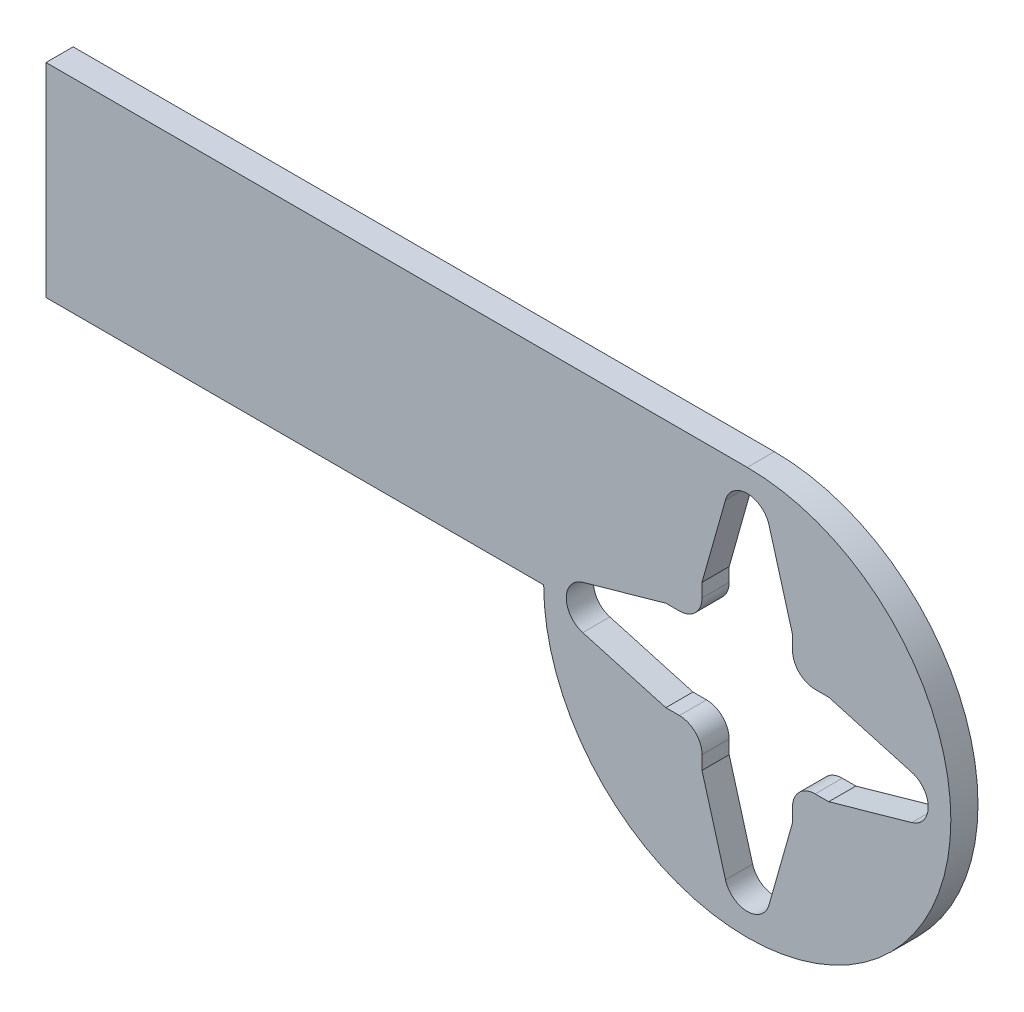
ISO-10303-21;
HEADER;
FILE_DESCRIPTION(('STEP AP214'),'2;1');
FILE_NAME('part.step','',(''),(''),'','','');
FILE_SCHEMA(('AUTOMOTIVE_DESIGN { 1 0 10303 214 1 1 1 1 }'));
ENDSEC;
DATA;
#1=APPLICATION_CONTEXT('core data for automotive mechanical design processes');
#2=APPLICATION_PROTOCOL_DEFINITION('international standard','automotive_design',2000,#1);
#3=PRODUCT_CONTEXT('',#1,'mechanical');
#4=PRODUCT('Part','Part','',(#3));
#5=PRODUCT_RELATED_PRODUCT_CATEGORY('part','',(#4));
#6=PRODUCT_DEFINITION_FORMATION('','',#4);
#7=PRODUCT_DEFINITION_CONTEXT('part definition',#1,'design');
#8=PRODUCT_DEFINITION('design','',#6,#7);
#9=PRODUCT_DEFINITION_SHAPE('','',#8);
#10=(LENGTH_UNIT() NAMED_UNIT(*) SI_UNIT(.MILLI.,.METRE.));
#11=(NAMED_UNIT(*) PLANE_ANGLE_UNIT() SI_UNIT($,.RADIAN.));
#12=(NAMED_UNIT(*) SI_UNIT($,.STERADIAN.) SOLID_ANGLE_UNIT());
#13=UNCERTAINTY_MEASURE_WITH_UNIT(LENGTH_MEASURE(1.E-05),#10,'distance_accuracy_value','');
#14=(GEOMETRIC_REPRESENTATION_CONTEXT(3) GLOBAL_UNCERTAINTY_ASSIGNED_CONTEXT((#13)) GLOBAL_UNIT_ASSIGNED_CONTEXT((#10,
#11,#12)) REPRESENTATION_CONTEXT('',''));
#15=CARTESIAN_POINT('',(0.,0.,0.));
#16=DIRECTION('',(0.,0.,1.));
#17=DIRECTION('',(1.,0.,0.));
#18=AXIS2_PLACEMENT_3D('',#15,#16,#17);
#19=CARTESIAN_POINT('',(0.,0.,3.));
#20=DIRECTION('',(0.,0.,-1.));
#21=DIRECTION('',(-1.,0.,0.));
#22=AXIS2_PLACEMENT_3D('',#19,#20,#21);
#23=CYLINDRICAL_SURFACE('',#22,22.5);
#24=CARTESIAN_POINT('',(0.,0.,0.));
#25=DIRECTION('',(0.,0.,1.));
#26=DIRECTION('',(1.,0.,0.));
#27=AXIS2_PLACEMENT_3D('',#24,#25,#26);
#28=CIRCLE('',#27,22.5);
#29=CARTESIAN_POINT('',(-22.5,0.,0.));
#30=VERTEX_POINT('',#29);
#31=CARTESIAN_POINT('',(0.,22.5,0.));
#32=VERTEX_POINT('',#31);
#33=EDGE_CURVE('E395',#30,#32,#28,.T.);
#34=ORIENTED_EDGE('',*,*,#33,.T.);
#35=DIRECTION('',(0.,0.,-1.));
#36=VECTOR('',#35,1.);
#37=CARTESIAN_POINT('',(0.,22.5,3.));
#38=LINE('',#37,#36);
#39=CARTESIAN_POINT('',(0.,22.5,3.));
#40=VERTEX_POINT('',#39);
#41=EDGE_CURVE('E142',#40,#32,#38,.T.);
#42=ORIENTED_EDGE('',*,*,#41,.F.);
#43=CARTESIAN_POINT('',(0.,0.,3.));
#44=DIRECTION('',(0.,0.,1.));
#45=DIRECTION('',(1.,0.,0.));
#46=AXIS2_PLACEMENT_3D('',#43,#44,#45);
#47=CIRCLE('',#46,22.5);
#48=CARTESIAN_POINT('',(-22.5,0.,3.));
#49=VERTEX_POINT('',#48);
#50=EDGE_CURVE('E391',#49,#40,#47,.T.);
#51=ORIENTED_EDGE('',*,*,#50,.F.);
#52=DIRECTION('',(0.,0.,-1.));
#53=VECTOR('',#52,1.);
#54=CARTESIAN_POINT('',(-22.5,0.,3.));
#55=LINE('',#54,#53);
#56=EDGE_CURVE('E12',#49,#30,#55,.T.);
#57=ORIENTED_EDGE('',*,*,#56,.T.);
#58=EDGE_LOOP('',(#34,#42,#51,#57));
#59=FACE_BOUND('',#58,.T.);
#60=ADVANCED_FACE('F131',(#59),#23,.T.);
#61=CARTESIAN_POINT('',(5.,0.,3.));
#62=DIRECTION('',(1.,0.,0.));
#63=DIRECTION('',(0.,0.,-1.));
#64=AXIS2_PLACEMENT_3D('',#61,#62,#63);
#65=PLANE('',#64);
#66=DIRECTION('',(0.,-1.,0.));
#67=VECTOR('',#66,1.);
#68=CARTESIAN_POINT('',(5.,0.,0.));
#69=LINE('',#68,#67);
#70=CARTESIAN_POINT('',(5.,-7.5,0.));
#71=VERTEX_POINT('',#70);
#72=CARTESIAN_POINT('',(5.,-9.,0.));
#73=VERTEX_POINT('',#72);
#74=EDGE_CURVE('E313',#71,#73,#69,.T.);
#75=ORIENTED_EDGE('',*,*,#74,.T.);
#76=DIRECTION('',(0.,0.,-1.));
#77=VECTOR('',#76,1.);
#78=CARTESIAN_POINT('',(5.,-9.,3.));
#79=LINE('',#78,#77);
#80=CARTESIAN_POINT('',(5.,-9.,3.));
#81=VERTEX_POINT('',#80);
#82=EDGE_CURVE('E317',#81,#73,#79,.T.);
#83=ORIENTED_EDGE('',*,*,#82,.F.);
#84=DIRECTION('',(0.,-1.,0.));
#85=VECTOR('',#84,1.);
#86=CARTESIAN_POINT('',(5.,0.,3.));
#87=LINE('',#86,#85);
#88=CARTESIAN_POINT('',(5.,-7.5,3.));
#89=VERTEX_POINT('',#88);
#90=EDGE_CURVE('E398',#89,#81,#87,.T.);
#91=ORIENTED_EDGE('',*,*,#90,.F.);
#92=DIRECTION('',(0.,0.,-1.));
#93=VECTOR('',#92,1.);
#94=CARTESIAN_POINT('',(5.,-7.5,3.));
#95=LINE('',#94,#93);
#96=EDGE_CURVE('E314',#89,#71,#95,.T.);
#97=ORIENTED_EDGE('',*,*,#96,.T.);
#98=EDGE_LOOP('',(#75,#83,#91,#97));
#99=FACE_BOUND('',#98,.T.);
#100=ADVANCED_FACE('F566',(#99),#65,.F.);
#101=CARTESIAN_POINT('',(6.98551163473582,-1.97409711694024,3.));
#102=DIRECTION('',(0.962311898410698,-0.271948175535705,0.));
#103=DIRECTION('',(0.271948175535705,0.962311898410698,0.));
#104=AXIS2_PLACEMENT_3D('',#101,#102,#103);
#105=PLANE('',#104);
#106=DIRECTION('',(-0.271948175535705,-0.962311898410698,0.));
#107=VECTOR('',#106,1.);
#108=CARTESIAN_POINT('',(6.98551163473582,-1.97409711694024,0.));
#109=LINE('',#108,#107);
#110=CARTESIAN_POINT('',(2.40577974602674,-18.1798704388393,0.));
#111=VERTEX_POINT('',#110);
#112=EDGE_CURVE('E467',#73,#111,#109,.T.);
#113=ORIENTED_EDGE('',*,*,#112,.T.);
#114=DIRECTION('',(0.,0.,-1.));
#115=VECTOR('',#114,1.);
#116=CARTESIAN_POINT('',(2.40577974602674,-18.1798704388393,3.));
#117=LINE('',#116,#115);
#118=CARTESIAN_POINT('',(2.40577974602674,-18.1798704388393,3.));
#119=VERTEX_POINT('',#118);
#120=EDGE_CURVE('E321',#119,#111,#117,.T.);
#121=ORIENTED_EDGE('',*,*,#120,.F.);
#122=DIRECTION('',(-0.271948175535705,-0.962311898410698,0.));
#123=VECTOR('',#122,1.);
#124=CARTESIAN_POINT('',(6.98551163473582,-1.97409711694024,3.));
#125=LINE('',#124,#123);
#126=EDGE_CURVE('E547',#81,#119,#125,.T.);
#127=ORIENTED_EDGE('',*,*,#126,.F.);
#128=ORIENTED_EDGE('',*,*,#82,.T.);
#129=EDGE_LOOP('',(#113,#121,#127,#128));
#130=FACE_BOUND('',#129,.T.);
#131=ADVANCED_FACE('F570',(#130),#105,.F.);
#132=CARTESIAN_POINT('',(0.,-17.5,3.));
#133=DIRECTION('',(0.,0.,-1.));
#134=DIRECTION('',(-1.,0.,0.));
#135=AXIS2_PLACEMENT_3D('',#132,#133,#134);
#136=CYLINDRICAL_SURFACE('',#135,2.5);
#137=CARTESIAN_POINT('',(0.,-17.5,0.));
#138=DIRECTION('',(0.,0.,1.));
#139=DIRECTION('',(1.,0.,0.));
#140=AXIS2_PLACEMENT_3D('',#137,#138,#139);
#141=CIRCLE('',#140,2.5);
#142=CARTESIAN_POINT('',(-2.40577974602674,-18.1798704388393,0.));
#143=VERTEX_POINT('',#142);
#144=EDGE_CURVE('E463',#111,#143,#141,.F.);
#145=ORIENTED_EDGE('',*,*,#144,.T.);
#146=DIRECTION('',(0.,0.,-1.));
#147=VECTOR('',#146,1.);
#148=CARTESIAN_POINT('',(-2.40577974602674,-18.1798704388393,3.));
#149=LINE('',#148,#147);
#150=CARTESIAN_POINT('',(-2.40577974602674,-18.1798704388393,3.));
#151=VERTEX_POINT('',#150);
#152=EDGE_CURVE('E325',#151,#143,#149,.T.);
#153=ORIENTED_EDGE('',*,*,#152,.F.);
#154=CARTESIAN_POINT('',(0.,-17.5,3.));
#155=DIRECTION('',(0.,0.,1.));
#156=DIRECTION('',(1.,0.,0.));
#157=AXIS2_PLACEMENT_3D('',#154,#155,#156);
#158=CIRCLE('',#157,2.5);
#159=EDGE_CURVE('E543',#119,#151,#158,.F.);
#160=ORIENTED_EDGE('',*,*,#159,.F.);
#161=ORIENTED_EDGE('',*,*,#120,.T.);
#162=EDGE_LOOP('',(#145,#153,#160,#161));
#163=FACE_BOUND('',#162,.T.);
#164=ADVANCED_FACE('F577',(#163),#136,.F.);
#165=CARTESIAN_POINT('',(-6.98551163473582,-1.97409711694024,3.));
#166=DIRECTION('',(0.962311898410698,0.271948175535705,0.));
#167=DIRECTION('',(-0.271948175535705,0.962311898410698,0.));
#168=AXIS2_PLACEMENT_3D('',#165,#166,#167);
#169=PLANE('',#168);
#170=DIRECTION('',(0.271948175535705,-0.962311898410698,0.));
#171=VECTOR('',#170,1.);
#172=CARTESIAN_POINT('',(-6.98551163473582,-1.97409711694024,0.));
#173=LINE('',#172,#171);
#174=CARTESIAN_POINT('',(-5.,-9.,0.));
#175=VERTEX_POINT('',#174);
#176=EDGE_CURVE('E459',#175,#143,#173,.T.);
#177=ORIENTED_EDGE('',*,*,#176,.F.);
#178=DIRECTION('',(0.,0.,-1.));
#179=VECTOR('',#178,1.);
#180=CARTESIAN_POINT('',(-5.,-9.,3.));
#181=LINE('',#180,#179);
#182=CARTESIAN_POINT('',(-5.,-9.,3.));
#183=VERTEX_POINT('',#182);
#184=EDGE_CURVE('E328',#183,#175,#181,.T.);
#185=ORIENTED_EDGE('',*,*,#184,.F.);
#186=DIRECTION('',(0.271948175535705,-0.962311898410698,0.));
#187=VECTOR('',#186,1.);
#188=CARTESIAN_POINT('',(-6.98551163473582,-1.97409711694024,3.));
#189=LINE('',#188,#187);
#190=EDGE_CURVE('E539',#183,#151,#189,.T.);
#191=ORIENTED_EDGE('',*,*,#190,.T.);
#192=ORIENTED_EDGE('',*,*,#152,.T.);
#193=EDGE_LOOP('',(#177,#185,#191,#192));
#194=FACE_BOUND('',#193,.T.);
#195=ADVANCED_FACE('F649',(#194),#169,.T.);
#196=CARTESIAN_POINT('',(-5.,0.,3.));
#197=DIRECTION('',(1.,0.,0.));
#198=DIRECTION('',(0.,0.,-1.));
#199=AXIS2_PLACEMENT_3D('',#196,#197,#198);
#200=PLANE('',#199);
#201=DIRECTION('',(0.,-1.,0.));
#202=VECTOR('',#201,1.);
#203=CARTESIAN_POINT('',(-5.,0.,0.));
#204=LINE('',#203,#202);
#205=CARTESIAN_POINT('',(-5.,-7.5,0.));
#206=VERTEX_POINT('',#205);
#207=EDGE_CURVE('E455',#206,#175,#204,.T.);
#208=ORIENTED_EDGE('',*,*,#207,.F.);
#209=DIRECTION('',(0.,0.,-1.));
#210=VECTOR('',#209,1.);
#211=CARTESIAN_POINT('',(-5.,-7.5,3.));
#212=LINE('',#211,#210);
#213=CARTESIAN_POINT('',(-5.,-7.5,3.));
#214=VERTEX_POINT('',#213);
#215=EDGE_CURVE('E331',#214,#206,#212,.T.);
#216=ORIENTED_EDGE('',*,*,#215,.F.);
#217=DIRECTION('',(0.,-1.,0.));
#218=VECTOR('',#217,1.);
#219=CARTESIAN_POINT('',(-5.,0.,3.));
#220=LINE('',#219,#218);
#221=EDGE_CURVE('E535',#214,#183,#220,.T.);
#222=ORIENTED_EDGE('',*,*,#221,.T.);
#223=ORIENTED_EDGE('',*,*,#184,.T.);
#224=EDGE_LOOP('',(#208,#216,#222,#223));
#225=FACE_BOUND('',#224,.T.);
#226=ADVANCED_FACE('F651',(#225),#200,.T.);
#227=CARTESIAN_POINT('',(0.,-5.,3.));
#228=DIRECTION('',(0.,-1.,0.));
#229=DIRECTION('',(1.,0.,0.));
#230=AXIS2_PLACEMENT_3D('',#227,#228,#229);
#231=PLANE('',#230);
#232=DIRECTION('',(-1.,0.,0.));
#233=VECTOR('',#232,1.);
#234=CARTESIAN_POINT('',(0.,-5.,0.));
#235=LINE('',#234,#233);
#236=CARTESIAN_POINT('',(-7.5,-5.,0.));
#237=VERTEX_POINT('',#236);
#238=CARTESIAN_POINT('',(-9.,-5.,0.));
#239=VERTEX_POINT('',#238);
#240=EDGE_CURVE('E452',#237,#239,#235,.T.);
#241=ORIENTED_EDGE('',*,*,#240,.T.);
#242=DIRECTION('',(0.,0.,-1.));
#243=VECTOR('',#242,1.);
#244=CARTESIAN_POINT('',(-9.,-5.,3.));
#245=LINE('',#244,#243);
#246=CARTESIAN_POINT('',(-9.,-5.,3.));
#247=VERTEX_POINT('',#246);
#248=EDGE_CURVE('E337',#247,#239,#245,.T.);
#249=ORIENTED_EDGE('',*,*,#248,.F.);
#250=DIRECTION('',(-1.,0.,0.));
#251=VECTOR('',#250,1.);
#252=CARTESIAN_POINT('',(0.,-5.,3.));
#253=LINE('',#252,#251);
#254=CARTESIAN_POINT('',(-7.5,-5.,3.));
#255=VERTEX_POINT('',#254);
#256=EDGE_CURVE('E531',#255,#247,#253,.T.);
#257=ORIENTED_EDGE('',*,*,#256,.F.);
#258=DIRECTION('',(0.,0.,-1.));
#259=VECTOR('',#258,1.);
#260=CARTESIAN_POINT('',(-7.5,-5.,3.));
#261=LINE('',#260,#259);
#262=EDGE_CURVE('E334',#255,#237,#261,.T.);
#263=ORIENTED_EDGE('',*,*,#262,.T.);
#264=EDGE_LOOP('',(#241,#249,#257,#263));
#265=FACE_BOUND('',#264,.T.);
#266=ADVANCED_FACE('F657',(#265),#231,.F.);
#267=CARTESIAN_POINT('',(-1.97409711694023,-6.98551163473581,3.));
#268=DIRECTION('',(-0.271948175535704,-0.962311898410698,0.));
#269=DIRECTION('',(0.962311898410698,-0.271948175535704,0.));
#270=AXIS2_PLACEMENT_3D('',#267,#268,#269);
#271=PLANE('',#270);
#272=DIRECTION('',(-0.962311898410698,0.271948175535704,0.));
#273=VECTOR('',#272,1.);
#274=CARTESIAN_POINT('',(-1.97409711694023,-6.98551163473581,0.));
#275=LINE('',#274,#273);
#276=CARTESIAN_POINT('',(-18.1798704388393,-2.40577974602675,0.));
#277=VERTEX_POINT('',#276);
#278=EDGE_CURVE('E449',#239,#277,#275,.T.);
#279=ORIENTED_EDGE('',*,*,#278,.T.);
#280=DIRECTION('',(0.,0.,-1.));
#281=VECTOR('',#280,1.);
#282=CARTESIAN_POINT('',(-18.1798704388393,-2.40577974602675,3.));
#283=LINE('',#282,#281);
#284=CARTESIAN_POINT('',(-18.1798704388393,-2.40577974602675,3.));
#285=VERTEX_POINT('',#284);
#286=EDGE_CURVE('E341',#285,#277,#283,.T.);
#287=ORIENTED_EDGE('',*,*,#286,.F.);
#288=DIRECTION('',(-0.962311898410698,0.271948175535704,0.));
#289=VECTOR('',#288,1.);
#290=CARTESIAN_POINT('',(-1.97409711694023,-6.98551163473581,3.));
#291=LINE('',#290,#289);
#292=EDGE_CURVE('E527',#247,#285,#291,.T.);
#293=ORIENTED_EDGE('',*,*,#292,.F.);
#294=ORIENTED_EDGE('',*,*,#248,.T.);
#295=EDGE_LOOP('',(#279,#287,#293,#294));
#296=FACE_BOUND('',#295,.T.);
#297=ADVANCED_FACE('F664',(#296),#271,.F.);
#298=CARTESIAN_POINT('',(-17.5,0.,3.));
#299=DIRECTION('',(0.,0.,-1.));
#300=DIRECTION('',(-1.,0.,0.));
#301=AXIS2_PLACEMENT_3D('',#298,#299,#300);
#302=CYLINDRICAL_SURFACE('',#301,2.5);
#303=CARTESIAN_POINT('',(-17.5,0.,0.));
#304=DIRECTION('',(0.,0.,1.));
#305=DIRECTION('',(1.,0.,0.));
#306=AXIS2_PLACEMENT_3D('',#303,#304,#305);
#307=CIRCLE('',#306,2.5);
#308=CARTESIAN_POINT('',(-18.1798704388393,2.40577974602675,0.));
#309=VERTEX_POINT('',#308);
#310=EDGE_CURVE('E445',#277,#309,#307,.F.);
#311=ORIENTED_EDGE('',*,*,#310,.T.);
#312=DIRECTION('',(0.,0.,-1.));
#313=VECTOR('',#312,1.);
#314=CARTESIAN_POINT('',(-18.1798704388393,2.40577974602675,3.));
#315=LINE('',#314,#313);
#316=CARTESIAN_POINT('',(-18.1798704388393,2.40577974602675,3.));
#317=VERTEX_POINT('',#316);
#318=EDGE_CURVE('E345',#317,#309,#315,.T.);
#319=ORIENTED_EDGE('',*,*,#318,.F.);
#320=CARTESIAN_POINT('',(-17.5,0.,3.));
#321=DIRECTION('',(0.,0.,1.));
#322=DIRECTION('',(1.,0.,0.));
#323=AXIS2_PLACEMENT_3D('',#320,#321,#322);
#324=CIRCLE('',#323,2.5);
#325=EDGE_CURVE('E523',#285,#317,#324,.F.);
#326=ORIENTED_EDGE('',*,*,#325,.F.);
#327=ORIENTED_EDGE('',*,*,#286,.T.);
#328=EDGE_LOOP('',(#311,#319,#326,#327));
#329=FACE_BOUND('',#328,.T.);
#330=ADVANCED_FACE('F670',(#329),#302,.F.);
#331=CARTESIAN_POINT('',(-1.97409711694023,6.98551163473581,3.));
#332=DIRECTION('',(0.271948175535704,-0.962311898410698,0.));
#333=DIRECTION('',(0.962311898410698,0.271948175535704,0.));
#334=AXIS2_PLACEMENT_3D('',#331,#332,#333);
#335=PLANE('',#334);
#336=DIRECTION('',(-0.962311898410698,-0.271948175535704,0.));
#337=VECTOR('',#336,1.);
#338=CARTESIAN_POINT('',(-1.97409711694023,6.98551163473581,0.));
#339=LINE('',#338,#337);
#340=CARTESIAN_POINT('',(-9.,5.,0.));
#341=VERTEX_POINT('',#340);
#342=EDGE_CURVE('E441',#341,#309,#339,.T.);
#343=ORIENTED_EDGE('',*,*,#342,.F.);
#344=DIRECTION('',(0.,0.,-1.));
#345=VECTOR('',#344,1.);
#346=CARTESIAN_POINT('',(-9.,5.,3.));
#347=LINE('',#346,#345);
#348=CARTESIAN_POINT('',(-9.,5.,3.));
#349=VERTEX_POINT('',#348);
#350=EDGE_CURVE('E348',#349,#341,#347,.T.);
#351=ORIENTED_EDGE('',*,*,#350,.F.);
#352=DIRECTION('',(-0.962311898410698,-0.271948175535704,0.));
#353=VECTOR('',#352,1.);
#354=CARTESIAN_POINT('',(-1.97409711694023,6.98551163473581,3.));
#355=LINE('',#354,#353);
#356=EDGE_CURVE('E519',#349,#317,#355,.T.);
#357=ORIENTED_EDGE('',*,*,#356,.T.);
#358=ORIENTED_EDGE('',*,*,#318,.T.);
#359=EDGE_LOOP('',(#343,#351,#357,#358));
#360=FACE_BOUND('',#359,.T.);
#361=ADVANCED_FACE('F674',(#360),#335,.T.);
#362=CARTESIAN_POINT('',(0.,5.,3.));
#363=DIRECTION('',(0.,-1.,0.));
#364=DIRECTION('',(1.,0.,0.));
#365=AXIS2_PLACEMENT_3D('',#362,#363,#364);
#366=PLANE('',#365);
#367=DIRECTION('',(-1.,0.,0.));
#368=VECTOR('',#367,1.);
#369=CARTESIAN_POINT('',(0.,5.,0.));
#370=LINE('',#369,#368);
#371=CARTESIAN_POINT('',(-7.5,5.,0.));
#372=VERTEX_POINT('',#371);
#373=EDGE_CURVE('E437',#372,#341,#370,.T.);
#374=ORIENTED_EDGE('',*,*,#373,.F.);
#375=DIRECTION('',(0.,0.,-1.));
#376=VECTOR('',#375,1.);
#377=CARTESIAN_POINT('',(-7.5,5.,3.));
#378=LINE('',#377,#376);
#379=CARTESIAN_POINT('',(-7.5,5.,3.));
#380=VERTEX_POINT('',#379);
#381=EDGE_CURVE('E351',#380,#372,#378,.T.);
#382=ORIENTED_EDGE('',*,*,#381,.F.);
#383=DIRECTION('',(-1.,0.,0.));
#384=VECTOR('',#383,1.);
#385=CARTESIAN_POINT('',(0.,5.,3.));
#386=LINE('',#385,#384);
#387=EDGE_CURVE('E515',#380,#349,#386,.T.);
#388=ORIENTED_EDGE('',*,*,#387,.T.);
#389=ORIENTED_EDGE('',*,*,#350,.T.);
#390=EDGE_LOOP('',(#374,#382,#388,#389));
#391=FACE_BOUND('',#390,.T.);
#392=ADVANCED_FACE('F677',(#391),#366,.T.);
#393=CARTESIAN_POINT('',(-5.,0.,3.));
#394=DIRECTION('',(-1.,0.,0.));
#395=DIRECTION('',(0.,0.,1.));
#396=AXIS2_PLACEMENT_3D('',#393,#394,#395);
#397=PLANE('',#396);
#398=DIRECTION('',(0.,1.,0.));
#399=VECTOR('',#398,1.);
#400=CARTESIAN_POINT('',(-5.,0.,0.));
#401=LINE('',#400,#399);
#402=CARTESIAN_POINT('',(-5.,7.5,0.));
#403=VERTEX_POINT('',#402);
#404=CARTESIAN_POINT('',(-5.,9.,0.));
#405=VERTEX_POINT('',#404);
#406=EDGE_CURVE('E434',#403,#405,#401,.T.);
#407=ORIENTED_EDGE('',*,*,#406,.T.);
#408=DIRECTION('',(0.,0.,-1.));
#409=VECTOR('',#408,1.);
#410=CARTESIAN_POINT('',(-5.,9.,3.));
#411=LINE('',#410,#409);
#412=CARTESIAN_POINT('',(-5.,9.,3.));
#413=VERTEX_POINT('',#412);
#414=EDGE_CURVE('E357',#413,#405,#411,.T.);
#415=ORIENTED_EDGE('',*,*,#414,.F.);
#416=DIRECTION('',(0.,1.,0.));
#417=VECTOR('',#416,1.);
#418=CARTESIAN_POINT('',(-5.,0.,3.));
#419=LINE('',#418,#417);
#420=CARTESIAN_POINT('',(-5.,7.5,3.));
#421=VERTEX_POINT('',#420);
#422=EDGE_CURVE('E511',#421,#413,#419,.T.);
#423=ORIENTED_EDGE('',*,*,#422,.F.);
#424=DIRECTION('',(0.,0.,-1.));
#425=VECTOR('',#424,1.);
#426=CARTESIAN_POINT('',(-5.,7.5,3.));
#427=LINE('',#426,#425);
#428=EDGE_CURVE('E354',#421,#403,#427,.T.);
#429=ORIENTED_EDGE('',*,*,#428,.T.);
#430=EDGE_LOOP('',(#407,#415,#423,#429));
#431=FACE_BOUND('',#430,.T.);
#432=ADVANCED_FACE('F683',(#431),#397,.F.);
#433=CARTESIAN_POINT('',(-6.98551163473582,1.97409711694024,3.));
#434=DIRECTION('',(-0.962311898410698,0.271948175535705,0.));
#435=DIRECTION('',(-0.271948175535705,-0.962311898410698,0.));
#436=AXIS2_PLACEMENT_3D('',#433,#434,#435);
#437=PLANE('',#436);
#438=DIRECTION('',(0.271948175535705,0.962311898410698,0.));
#439=VECTOR('',#438,1.);
#440=CARTESIAN_POINT('',(-6.98551163473582,1.97409711694024,0.));
#441=LINE('',#440,#439);
#442=CARTESIAN_POINT('',(-2.40577974602674,18.1798704388393,0.));
#443=VERTEX_POINT('',#442);
#444=EDGE_CURVE('E430',#405,#443,#441,.T.);
#445=ORIENTED_EDGE('',*,*,#444,.T.);
#446=DIRECTION('',(0.,0.,-1.));
#447=VECTOR('',#446,1.);
#448=CARTESIAN_POINT('',(-2.40577974602674,18.1798704388393,3.));
#449=LINE('',#448,#447);
#450=CARTESIAN_POINT('',(-2.40577974602674,18.1798704388393,3.));
#451=VERTEX_POINT('',#450);
#452=EDGE_CURVE('E361',#451,#443,#449,.T.);
#453=ORIENTED_EDGE('',*,*,#452,.F.);
#454=DIRECTION('',(0.271948175535705,0.962311898410698,0.));
#455=VECTOR('',#454,1.);
#456=CARTESIAN_POINT('',(-6.98551163473582,1.97409711694024,3.));
#457=LINE('',#456,#455);
#458=EDGE_CURVE('E507',#413,#451,#457,.T.);
#459=ORIENTED_EDGE('',*,*,#458,.F.);
#460=ORIENTED_EDGE('',*,*,#414,.T.);
#461=EDGE_LOOP('',(#445,#453,#459,#460));
#462=FACE_BOUND('',#461,.T.);
#463=ADVANCED_FACE('F689',(#462),#437,.F.);
#464=CARTESIAN_POINT('',(0.,17.5,3.));
#465=DIRECTION('',(0.,0.,-1.));
#466=DIRECTION('',(-1.,0.,0.));
#467=AXIS2_PLACEMENT_3D('',#464,#465,#466);
#468=CYLINDRICAL_SURFACE('',#467,2.5);
#469=CARTESIAN_POINT('',(0.,17.5,0.));
#470=DIRECTION('',(0.,0.,1.));
#471=DIRECTION('',(1.,0.,0.));
#472=AXIS2_PLACEMENT_3D('',#469,#470,#471);
#473=CIRCLE('',#472,2.5);
#474=CARTESIAN_POINT('',(2.40577974602674,18.1798704388393,0.));
#475=VERTEX_POINT('',#474);
#476=EDGE_CURVE('E426',#475,#443,#473,.T.);
#477=ORIENTED_EDGE('',*,*,#476,.F.);
#478=DIRECTION('',(0.,0.,-1.));
#479=VECTOR('',#478,1.);
#480=CARTESIAN_POINT('',(2.40577974602674,18.1798704388393,3.));
#481=LINE('',#480,#479);
#482=CARTESIAN_POINT('',(2.40577974602674,18.1798704388393,3.));
#483=VERTEX_POINT('',#482);
#484=EDGE_CURVE('E364',#483,#475,#481,.T.);
#485=ORIENTED_EDGE('',*,*,#484,.F.);
#486=CARTESIAN_POINT('',(0.,17.5,3.));
#487=DIRECTION('',(0.,0.,1.));
#488=DIRECTION('',(1.,0.,0.));
#489=AXIS2_PLACEMENT_3D('',#486,#487,#488);
#490=CIRCLE('',#489,2.5);
#491=EDGE_CURVE('E503',#483,#451,#490,.T.);
#492=ORIENTED_EDGE('',*,*,#491,.T.);
#493=ORIENTED_EDGE('',*,*,#452,.T.);
#494=EDGE_LOOP('',(#477,#485,#492,#493));
#495=FACE_BOUND('',#494,.T.);
#496=ADVANCED_FACE('F760',(#495),#468,.F.);
#497=CARTESIAN_POINT('',(6.98551163473582,1.97409711694024,3.));
#498=DIRECTION('',(-0.962311898410698,-0.271948175535705,0.));
#499=DIRECTION('',(0.271948175535705,-0.962311898410698,0.));
#500=AXIS2_PLACEMENT_3D('',#497,#498,#499);
#501=PLANE('',#500);
#502=DIRECTION('',(-0.271948175535705,0.962311898410698,0.));
#503=VECTOR('',#502,1.);
#504=CARTESIAN_POINT('',(6.98551163473582,1.97409711694024,0.));
#505=LINE('',#504,#503);
#506=CARTESIAN_POINT('',(5.,9.,0.));
#507=VERTEX_POINT('',#506);
#508=EDGE_CURVE('E422',#507,#475,#505,.T.);
#509=ORIENTED_EDGE('',*,*,#508,.F.);
#510=DIRECTION('',(0.,0.,-1.));
#511=VECTOR('',#510,1.);
#512=CARTESIAN_POINT('',(5.,9.,3.));
#513=LINE('',#512,#511);
#514=CARTESIAN_POINT('',(5.,9.,3.));
#515=VERTEX_POINT('',#514);
#516=EDGE_CURVE('E367',#515,#507,#513,.T.);
#517=ORIENTED_EDGE('',*,*,#516,.F.);
#518=DIRECTION('',(-0.271948175535705,0.962311898410698,0.));
#519=VECTOR('',#518,1.);
#520=CARTESIAN_POINT('',(6.98551163473582,1.97409711694024,3.));
#521=LINE('',#520,#519);
#522=EDGE_CURVE('E499',#515,#483,#521,.T.);
#523=ORIENTED_EDGE('',*,*,#522,.T.);
#524=ORIENTED_EDGE('',*,*,#484,.T.);
#525=EDGE_LOOP('',(#509,#517,#523,#524));
#526=FACE_BOUND('',#525,.T.);
#527=ADVANCED_FACE('F696',(#526),#501,.T.);
#528=CARTESIAN_POINT('',(5.,0.,3.));
#529=DIRECTION('',(-1.,0.,0.));
#530=DIRECTION('',(0.,0.,1.));
#531=AXIS2_PLACEMENT_3D('',#528,#529,#530);
#532=PLANE('',#531);
#533=DIRECTION('',(0.,1.,0.));
#534=VECTOR('',#533,1.);
#535=CARTESIAN_POINT('',(5.,0.,0.));
#536=LINE('',#535,#534);
#537=CARTESIAN_POINT('',(5.,7.5,0.));
#538=VERTEX_POINT('',#537);
#539=EDGE_CURVE('E418',#538,#507,#536,.T.);
#540=ORIENTED_EDGE('',*,*,#539,.F.);
#541=DIRECTION('',(0.,0.,-1.));
#542=VECTOR('',#541,1.);
#543=CARTESIAN_POINT('',(5.,7.5,3.));
#544=LINE('',#543,#542);
#545=CARTESIAN_POINT('',(5.,7.5,3.));
#546=VERTEX_POINT('',#545);
#547=EDGE_CURVE('E370',#546,#538,#544,.T.);
#548=ORIENTED_EDGE('',*,*,#547,.F.);
#549=DIRECTION('',(0.,1.,0.));
#550=VECTOR('',#549,1.);
#551=CARTESIAN_POINT('',(5.,0.,3.));
#552=LINE('',#551,#550);
#553=EDGE_CURVE('E495',#546,#515,#552,.T.);
#554=ORIENTED_EDGE('',*,*,#553,.T.);
#555=ORIENTED_EDGE('',*,*,#516,.T.);
#556=EDGE_LOOP('',(#540,#548,#554,#555));
#557=FACE_BOUND('',#556,.T.);
#558=ADVANCED_FACE('F700',(#557),#532,.T.);
#559=CARTESIAN_POINT('',(0.,5.,3.));
#560=DIRECTION('',(0.,1.,0.));
#561=DIRECTION('',(-1.,0.,0.));
#562=AXIS2_PLACEMENT_3D('',#559,#560,#561);
#563=PLANE('',#562);
#564=DIRECTION('',(1.,0.,0.));
#565=VECTOR('',#564,1.);
#566=CARTESIAN_POINT('',(0.,5.,0.));
#567=LINE('',#566,#565);
#568=CARTESIAN_POINT('',(7.5,5.,0.));
#569=VERTEX_POINT('',#568);
#570=CARTESIAN_POINT('',(9.,5.,0.));
#571=VERTEX_POINT('',#570);
#572=EDGE_CURVE('E415',#569,#571,#567,.T.);
#573=ORIENTED_EDGE('',*,*,#572,.T.);
#574=DIRECTION('',(0.,0.,-1.));
#575=VECTOR('',#574,1.);
#576=CARTESIAN_POINT('',(9.,5.,3.));
#577=LINE('',#576,#575);
#578=CARTESIAN_POINT('',(9.,5.,3.));
#579=VERTEX_POINT('',#578);
#580=EDGE_CURVE('E376',#579,#571,#577,.T.);
#581=ORIENTED_EDGE('',*,*,#580,.F.);
#582=DIRECTION('',(1.,0.,0.));
#583=VECTOR('',#582,1.);
#584=CARTESIAN_POINT('',(0.,5.,3.));
#585=LINE('',#584,#583);
#586=CARTESIAN_POINT('',(7.5,5.,3.));
#587=VERTEX_POINT('',#586);
#588=EDGE_CURVE('E491',#587,#579,#585,.T.);
#589=ORIENTED_EDGE('',*,*,#588,.F.);
#590=DIRECTION('',(0.,0.,-1.));
#591=VECTOR('',#590,1.);
#592=CARTESIAN_POINT('',(7.5,5.,3.));
#593=LINE('',#592,#591);
#594=EDGE_CURVE('E373',#587,#569,#593,.T.);
#595=ORIENTED_EDGE('',*,*,#594,.T.);
#596=EDGE_LOOP('',(#573,#581,#589,#595));
#597=FACE_BOUND('',#596,.T.);
#598=ADVANCED_FACE('F706',(#597),#563,.F.);
#599=CARTESIAN_POINT('',(1.97409711694023,6.98551163473581,3.));
#600=DIRECTION('',(0.271948175535704,0.962311898410698,0.));
#601=DIRECTION('',(-0.962311898410698,0.271948175535704,0.));
#602=AXIS2_PLACEMENT_3D('',#599,#600,#601);
#603=PLANE('',#602);
#604=DIRECTION('',(0.962311898410698,-0.271948175535704,0.));
#605=VECTOR('',#604,1.);
#606=CARTESIAN_POINT('',(1.97409711694023,6.98551163473581,0.));
#607=LINE('',#606,#605);
#608=CARTESIAN_POINT('',(18.1798704388393,2.40577974602675,0.));
#609=VERTEX_POINT('',#608);
#610=EDGE_CURVE('E411',#571,#609,#607,.T.);
#611=ORIENTED_EDGE('',*,*,#610,.T.);
#612=DIRECTION('',(0.,0.,-1.));
#613=VECTOR('',#612,1.);
#614=CARTESIAN_POINT('',(18.1798704388393,2.40577974602675,3.));
#615=LINE('',#614,#613);
#616=CARTESIAN_POINT('',(18.1798704388393,2.40577974602675,3.));
#617=VERTEX_POINT('',#616);
#618=EDGE_CURVE('E380',#617,#609,#615,.T.);
#619=ORIENTED_EDGE('',*,*,#618,.F.);
#620=DIRECTION('',(0.962311898410698,-0.271948175535704,0.));
#621=VECTOR('',#620,1.);
#622=CARTESIAN_POINT('',(1.97409711694023,6.98551163473581,3.));
#623=LINE('',#622,#621);
#624=EDGE_CURVE('E487',#579,#617,#623,.T.);
#625=ORIENTED_EDGE('',*,*,#624,.F.);
#626=ORIENTED_EDGE('',*,*,#580,.T.);
#627=EDGE_LOOP('',(#611,#619,#625,#626));
#628=FACE_BOUND('',#627,.T.);
#629=ADVANCED_FACE('F713',(#628),#603,.F.);
#630=CARTESIAN_POINT('',(17.5,0.,3.));
#631=DIRECTION('',(0.,0.,-1.));
#632=DIRECTION('',(-1.,0.,0.));
#633=AXIS2_PLACEMENT_3D('',#630,#631,#632);
#634=CYLINDRICAL_SURFACE('',#633,2.5);
#635=CARTESIAN_POINT('',(17.5,0.,0.));
#636=DIRECTION('',(0.,0.,1.));
#637=DIRECTION('',(1.,0.,0.));
#638=AXIS2_PLACEMENT_3D('',#635,#636,#637);
#639=CIRCLE('',#638,2.5);
#640=CARTESIAN_POINT('',(18.1798704388393,-2.40577974602675,0.));
#641=VERTEX_POINT('',#640);
#642=EDGE_CURVE('E407',#641,#609,#639,.T.);
#643=ORIENTED_EDGE('',*,*,#642,.F.);
#644=DIRECTION('',(0.,0.,-1.));
#645=VECTOR('',#644,1.);
#646=CARTESIAN_POINT('',(18.1798704388393,-2.40577974602675,3.));
#647=LINE('',#646,#645);
#648=CARTESIAN_POINT('',(18.1798704388393,-2.40577974602675,3.));
#649=VERTEX_POINT('',#648);
#650=EDGE_CURVE('E383',#649,#641,#647,.T.);
#651=ORIENTED_EDGE('',*,*,#650,.F.);
#652=CARTESIAN_POINT('',(17.5,0.,3.));
#653=DIRECTION('',(0.,0.,1.));
#654=DIRECTION('',(1.,0.,0.));
#655=AXIS2_PLACEMENT_3D('',#652,#653,#654);
#656=CIRCLE('',#655,2.5);
#657=EDGE_CURVE('E483',#649,#617,#656,.T.);
#658=ORIENTED_EDGE('',*,*,#657,.T.);
#659=ORIENTED_EDGE('',*,*,#618,.T.);
#660=EDGE_LOOP('',(#643,#651,#658,#659));
#661=FACE_BOUND('',#660,.T.);
#662=ADVANCED_FACE('F715',(#661),#634,.F.);
#663=CARTESIAN_POINT('',(1.97409711694023,-6.98551163473581,3.));
#664=DIRECTION('',(-0.271948175535704,0.962311898410698,0.));
#665=DIRECTION('',(-0.962311898410698,-0.271948175535704,0.));
#666=AXIS2_PLACEMENT_3D('',#663,#664,#665);
#667=PLANE('',#666);
#668=DIRECTION('',(0.962311898410698,0.271948175535704,0.));
#669=VECTOR('',#668,1.);
#670=CARTESIAN_POINT('',(1.97409711694023,-6.98551163473581,0.));
#671=LINE('',#670,#669);
#672=CARTESIAN_POINT('',(9.,-5.,0.));
#673=VERTEX_POINT('',#672);
#674=EDGE_CURVE('E403',#673,#641,#671,.T.);
#675=ORIENTED_EDGE('',*,*,#674,.F.);
#676=DIRECTION('',(0.,0.,-1.));
#677=VECTOR('',#676,1.);
#678=CARTESIAN_POINT('',(9.,-5.,3.));
#679=LINE('',#678,#677);
#680=CARTESIAN_POINT('',(9.,-5.,3.));
#681=VERTEX_POINT('',#680);
#682=EDGE_CURVE('E386',#681,#673,#679,.T.);
#683=ORIENTED_EDGE('',*,*,#682,.F.);
#684=DIRECTION('',(0.962311898410698,0.271948175535704,0.));
#685=VECTOR('',#684,1.);
#686=CARTESIAN_POINT('',(1.97409711694023,-6.98551163473581,3.));
#687=LINE('',#686,#685);
#688=EDGE_CURVE('E479',#681,#649,#687,.T.);
#689=ORIENTED_EDGE('',*,*,#688,.T.);
#690=ORIENTED_EDGE('',*,*,#650,.T.);
#691=EDGE_LOOP('',(#675,#683,#689,#690));
#692=FACE_BOUND('',#691,.T.);
#693=ADVANCED_FACE('F643',(#692),#667,.T.);
#694=CARTESIAN_POINT('',(0.,-5.,3.));
#695=DIRECTION('',(0.,1.,0.));
#696=DIRECTION('',(0.,0.,1.));
#697=AXIS2_PLACEMENT_3D('',#694,#695,#696);
#698=PLANE('',#697);
#699=DIRECTION('',(1.,0.,0.));
#700=VECTOR('',#699,1.);
#701=CARTESIAN_POINT('',(0.,-5.,0.));
#702=LINE('',#701,#700);
#703=CARTESIAN_POINT('',(7.5,-5.,0.));
#704=VERTEX_POINT('',#703);
#705=EDGE_CURVE('E399',#704,#673,#702,.T.);
#706=ORIENTED_EDGE('',*,*,#705,.F.);
#707=DIRECTION('',(0.,0.,-1.));
#708=VECTOR('',#707,1.);
#709=CARTESIAN_POINT('',(7.5,-5.,3.));
#710=LINE('',#709,#708);
#711=CARTESIAN_POINT('',(7.5,-5.,3.));
#712=VERTEX_POINT('',#711);
#713=EDGE_CURVE('E389',#712,#704,#710,.T.);
#714=ORIENTED_EDGE('',*,*,#713,.F.);
#715=DIRECTION('',(1.,0.,0.));
#716=VECTOR('',#715,1.);
#717=CARTESIAN_POINT('',(0.,-5.,3.));
#718=LINE('',#717,#716);
#719=EDGE_CURVE('E475',#712,#681,#718,.T.);
#720=ORIENTED_EDGE('',*,*,#719,.T.);
#721=ORIENTED_EDGE('',*,*,#682,.T.);
#722=EDGE_LOOP('',(#706,#714,#720,#721));
#723=FACE_BOUND('',#722,.T.);
#724=ADVANCED_FACE('F634',(#723),#698,.T.);
#725=CARTESIAN_POINT('',(0.,0.,0.));
#726=DIRECTION('',(0.,0.,1.));
#727=DIRECTION('',(1.,0.,0.));
#728=AXIS2_PLACEMENT_3D('',#725,#726,#727);
#729=PLANE('',#728);
#730=ORIENTED_EDGE('',*,*,#74,.F.);
#731=CARTESIAN_POINT('',(7.5,-7.5,0.));
#732=DIRECTION('',(0.,0.,1.));
#733=DIRECTION('',(1.,0.,0.));
#734=AXIS2_PLACEMENT_3D('',#731,#732,#733);
#735=CIRCLE('',#734,2.5);
#736=EDGE_CURVE('E289',#704,#71,#735,.T.);
#737=ORIENTED_EDGE('',*,*,#736,.F.);
#738=ORIENTED_EDGE('',*,*,#705,.T.);
#739=ORIENTED_EDGE('',*,*,#674,.T.);
#740=ORIENTED_EDGE('',*,*,#642,.T.);
#741=ORIENTED_EDGE('',*,*,#610,.F.);
#742=ORIENTED_EDGE('',*,*,#572,.F.);
#743=CARTESIAN_POINT('',(7.5,7.5,0.));
#744=DIRECTION('',(0.,0.,-1.));
#745=DIRECTION('',(-1.,0.,0.));
#746=AXIS2_PLACEMENT_3D('',#743,#744,#745);
#747=CIRCLE('',#746,2.5);
#748=EDGE_CURVE('E297',#569,#538,#747,.T.);
#749=ORIENTED_EDGE('',*,*,#748,.T.);
#750=ORIENTED_EDGE('',*,*,#539,.T.);
#751=ORIENTED_EDGE('',*,*,#508,.T.);
#752=ORIENTED_EDGE('',*,*,#476,.T.);
#753=ORIENTED_EDGE('',*,*,#444,.F.);
#754=ORIENTED_EDGE('',*,*,#406,.F.);
#755=CARTESIAN_POINT('',(-7.5,7.5,0.));
#756=DIRECTION('',(0.,0.,1.));
#757=DIRECTION('',(1.,0.,0.));
#758=AXIS2_PLACEMENT_3D('',#755,#756,#757);
#759=CIRCLE('',#758,2.5);
#760=EDGE_CURVE('E305',#372,#403,#759,.T.);
#761=ORIENTED_EDGE('',*,*,#760,.F.);
#762=ORIENTED_EDGE('',*,*,#373,.T.);
#763=ORIENTED_EDGE('',*,*,#342,.T.);
#764=ORIENTED_EDGE('',*,*,#310,.F.);
#765=ORIENTED_EDGE('',*,*,#278,.F.);
#766=ORIENTED_EDGE('',*,*,#240,.F.);
#767=CARTESIAN_POINT('',(-7.5,-7.5,0.));
#768=DIRECTION('',(0.,0.,-1.));
#769=DIRECTION('',(-1.,0.,0.));
#770=AXIS2_PLACEMENT_3D('',#767,#768,#769);
#771=CIRCLE('',#770,2.5);
#772=EDGE_CURVE('E281',#237,#206,#771,.T.);
#773=ORIENTED_EDGE('',*,*,#772,.T.);
#774=ORIENTED_EDGE('',*,*,#207,.T.);
#775=ORIENTED_EDGE('',*,*,#176,.T.);
#776=ORIENTED_EDGE('',*,*,#144,.F.);
#777=ORIENTED_EDGE('',*,*,#112,.F.);
#778=EDGE_LOOP('',(#730,#737,#738,#739,#740,#741,#742,#749,#750,#751,#752,#753,#754,#761,#762,
#763,#764,#765,#766,#773,#774,#775,#776,#777));
#779=FACE_BOUND('',#778,.T.);
#780=ORIENTED_EDGE('',*,*,#33,.F.);
#781=DIRECTION('',(-1.,0.,0.));
#782=VECTOR('',#781,1.);
#783=CARTESIAN_POINT('',(-22.5,0.,0.));
#784=LINE('',#783,#782);
#785=CARTESIAN_POINT('',(-77.5,0.,0.));
#786=VERTEX_POINT('',#785);
#787=EDGE_CURVE('E268',#30,#786,#784,.T.);
#788=ORIENTED_EDGE('',*,*,#787,.T.);
#789=DIRECTION('',(0.,-1.,0.));
#790=VECTOR('',#789,1.);
#791=CARTESIAN_POINT('',(-77.5,22.5,0.));
#792=LINE('',#791,#790);
#793=CARTESIAN_POINT('',(-77.5,22.5,0.));
#794=VERTEX_POINT('',#793);
#795=EDGE_CURVE('E263',#794,#786,#792,.T.);
#796=ORIENTED_EDGE('',*,*,#795,.F.);
#797=DIRECTION('',(1.,0.,0.));
#798=VECTOR('',#797,1.);
#799=CARTESIAN_POINT('',(-22.5,22.5,0.));
#800=LINE('',#799,#798);
#801=EDGE_CURVE('E250',#794,#32,#800,.T.);
#802=ORIENTED_EDGE('',*,*,#801,.T.);
#803=EDGE_LOOP('',(#780,#788,#796,#802));
#804=FACE_BOUND('',#803,.T.);
#805=ADVANCED_FACE('F267',(#779,#804),#729,.F.);
#806=CARTESIAN_POINT('',(0.,0.,3.));
#807=DIRECTION('',(0.,0.,1.));
#808=DIRECTION('',(1.,0.,0.));
#809=AXIS2_PLACEMENT_3D('',#806,#807,#808);
#810=PLANE('',#809);
#811=ORIENTED_EDGE('',*,*,#719,.F.);
#812=CARTESIAN_POINT('',(7.5,-7.5,3.));
#813=DIRECTION('',(0.,0.,1.));
#814=DIRECTION('',(1.,0.,0.));
#815=AXIS2_PLACEMENT_3D('',#812,#813,#814);
#816=CIRCLE('',#815,2.5);
#817=EDGE_CURVE('E293',#712,#89,#816,.T.);
#818=ORIENTED_EDGE('',*,*,#817,.T.);
#819=ORIENTED_EDGE('',*,*,#90,.T.);
#820=ORIENTED_EDGE('',*,*,#126,.T.);
#821=ORIENTED_EDGE('',*,*,#159,.T.);
#822=ORIENTED_EDGE('',*,*,#190,.F.);
#823=ORIENTED_EDGE('',*,*,#221,.F.);
#824=CARTESIAN_POINT('',(-7.5,-7.5,3.));
#825=DIRECTION('',(0.,0.,-1.));
#826=DIRECTION('',(-1.,0.,0.));
#827=AXIS2_PLACEMENT_3D('',#824,#825,#826);
#828=CIRCLE('',#827,2.5);
#829=EDGE_CURVE('E285',#255,#214,#828,.T.);
#830=ORIENTED_EDGE('',*,*,#829,.F.);
#831=ORIENTED_EDGE('',*,*,#256,.T.);
#832=ORIENTED_EDGE('',*,*,#292,.T.);
#833=ORIENTED_EDGE('',*,*,#325,.T.);
#834=ORIENTED_EDGE('',*,*,#356,.F.);
#835=ORIENTED_EDGE('',*,*,#387,.F.);
#836=CARTESIAN_POINT('',(-7.5,7.5,3.));
#837=DIRECTION('',(0.,0.,1.));
#838=DIRECTION('',(1.,0.,0.));
#839=AXIS2_PLACEMENT_3D('',#836,#837,#838);
#840=CIRCLE('',#839,2.5);
#841=EDGE_CURVE('E309',#380,#421,#840,.T.);
#842=ORIENTED_EDGE('',*,*,#841,.T.);
#843=ORIENTED_EDGE('',*,*,#422,.T.);
#844=ORIENTED_EDGE('',*,*,#458,.T.);
#845=ORIENTED_EDGE('',*,*,#491,.F.);
#846=ORIENTED_EDGE('',*,*,#522,.F.);
#847=ORIENTED_EDGE('',*,*,#553,.F.);
#848=CARTESIAN_POINT('',(7.5,7.5,3.));
#849=DIRECTION('',(0.,0.,-1.));
#850=DIRECTION('',(-1.,0.,0.));
#851=AXIS2_PLACEMENT_3D('',#848,#849,#850);
#852=CIRCLE('',#851,2.5);
#853=EDGE_CURVE('E301',#587,#546,#852,.T.);
#854=ORIENTED_EDGE('',*,*,#853,.F.);
#855=ORIENTED_EDGE('',*,*,#588,.T.);
#856=ORIENTED_EDGE('',*,*,#624,.T.);
#857=ORIENTED_EDGE('',*,*,#657,.F.);
#858=ORIENTED_EDGE('',*,*,#688,.F.);
#859=EDGE_LOOP('',(#811,#818,#819,#820,#821,#822,#823,#830,#831,#832,#833,#834,#835,#842,#843,
#844,#845,#846,#847,#854,#855,#856,#857,#858));
#860=FACE_BOUND('',#859,.T.);
#861=ORIENTED_EDGE('',*,*,#50,.T.);
#862=DIRECTION('',(1.,0.,0.));
#863=VECTOR('',#862,1.);
#864=CARTESIAN_POINT('',(-22.5,22.5,3.));
#865=LINE('',#864,#863);
#866=CARTESIAN_POINT('',(-77.5,22.5,3.));
#867=VERTEX_POINT('',#866);
#868=EDGE_CURVE('E259',#867,#40,#865,.T.);
#869=ORIENTED_EDGE('',*,*,#868,.F.);
#870=DIRECTION('',(0.,-1.,0.));
#871=VECTOR('',#870,1.);
#872=CARTESIAN_POINT('',(-77.5,22.5,3.));
#873=LINE('',#872,#871);
#874=CARTESIAN_POINT('',(-77.5,0.,3.));
#875=VERTEX_POINT('',#874);
#876=EDGE_CURVE('E265',#867,#875,#873,.T.);
#877=ORIENTED_EDGE('',*,*,#876,.T.);
#878=DIRECTION('',(-1.,0.,0.));
#879=VECTOR('',#878,1.);
#880=CARTESIAN_POINT('',(-22.5,0.,3.));
#881=LINE('',#880,#879);
#882=EDGE_CURVE('E270',#49,#875,#881,.T.);
#883=ORIENTED_EDGE('',*,*,#882,.F.);
#884=EDGE_LOOP('',(#861,#869,#877,#883));
#885=FACE_BOUND('',#884,.T.);
#886=ADVANCED_FACE('F558',(#860,#885),#810,.T.);
#887=CARTESIAN_POINT('',(-77.5,22.5,3.));
#888=DIRECTION('',(1.,0.,0.));
#889=DIRECTION('',(0.,0.,-1.));
#890=AXIS2_PLACEMENT_3D('',#887,#888,#889);
#891=PLANE('',#890);
#892=ORIENTED_EDGE('',*,*,#795,.T.);
#893=DIRECTION('',(0.,0.,-1.));
#894=VECTOR('',#893,1.);
#895=CARTESIAN_POINT('',(-77.5,0.,3.));
#896=LINE('',#895,#894);
#897=EDGE_CURVE('E135',#875,#786,#896,.T.);
#898=ORIENTED_EDGE('',*,*,#897,.F.);
#899=ORIENTED_EDGE('',*,*,#876,.F.);
#900=DIRECTION('',(0.,0.,-1.));
#901=VECTOR('',#900,1.);
#902=CARTESIAN_POINT('',(-77.5,22.5,3.));
#903=LINE('',#902,#901);
#904=EDGE_CURVE('E253',#867,#794,#903,.T.);
#905=ORIENTED_EDGE('',*,*,#904,.T.);
#906=EDGE_LOOP('',(#892,#898,#899,#905));
#907=FACE_BOUND('',#906,.T.);
#908=ADVANCED_FACE('F262',(#907),#891,.F.);
#909=CARTESIAN_POINT('',(-22.5,22.5,3.));
#910=DIRECTION('',(0.,1.,0.));
#911=DIRECTION('',(0.,0.,1.));
#912=AXIS2_PLACEMENT_3D('',#909,#910,#911);
#913=PLANE('',#912);
#914=ORIENTED_EDGE('',*,*,#801,.F.);
#915=ORIENTED_EDGE('',*,*,#904,.F.);
#916=ORIENTED_EDGE('',*,*,#868,.T.);
#917=ORIENTED_EDGE('',*,*,#41,.T.);
#918=EDGE_LOOP('',(#914,#915,#916,#917));
#919=FACE_BOUND('',#918,.T.);
#920=ADVANCED_FACE('F252',(#919),#913,.T.);
#921=CARTESIAN_POINT('',(-22.5,0.,3.));
#922=DIRECTION('',(0.,-1.,0.));
#923=DIRECTION('',(1.,0.,0.));
#924=AXIS2_PLACEMENT_3D('',#921,#922,#923);
#925=PLANE('',#924);
#926=ORIENTED_EDGE('',*,*,#787,.F.);
#927=ORIENTED_EDGE('',*,*,#56,.F.);
#928=ORIENTED_EDGE('',*,*,#882,.T.);
#929=ORIENTED_EDGE('',*,*,#897,.T.);
#930=EDGE_LOOP('',(#926,#927,#928,#929));
#931=FACE_BOUND('',#930,.T.);
#932=ADVANCED_FACE('F133',(#931),#925,.T.);
#933=CARTESIAN_POINT('',(-7.5,-7.5,3.));
#934=DIRECTION('',(0.,0.,-1.));
#935=DIRECTION('',(-1.,0.,0.));
#936=AXIS2_PLACEMENT_3D('',#933,#934,#935);
#937=CYLINDRICAL_SURFACE('',#936,2.5);
#938=ORIENTED_EDGE('',*,*,#829,.T.);
#939=ORIENTED_EDGE('',*,*,#215,.T.);
#940=ORIENTED_EDGE('',*,*,#772,.F.);
#941=ORIENTED_EDGE('',*,*,#262,.F.);
#942=EDGE_LOOP('',(#938,#939,#940,#941));
#943=FACE_BOUND('',#942,.T.);
#944=ADVANCED_FACE('F725',(#943),#937,.T.);
#945=CARTESIAN_POINT('',(7.5,-7.5,3.));
#946=DIRECTION('',(0.,0.,-1.));
#947=DIRECTION('',(-1.,0.,0.));
#948=AXIS2_PLACEMENT_3D('',#945,#946,#947);
#949=CYLINDRICAL_SURFACE('',#948,2.5);
#950=ORIENTED_EDGE('',*,*,#736,.T.);
#951=ORIENTED_EDGE('',*,*,#96,.F.);
#952=ORIENTED_EDGE('',*,*,#817,.F.);
#953=ORIENTED_EDGE('',*,*,#713,.T.);
#954=EDGE_LOOP('',(#950,#951,#952,#953));
#955=FACE_BOUND('',#954,.T.);
#956=ADVANCED_FACE('F638',(#955),#949,.T.);
#957=CARTESIAN_POINT('',(7.5,7.5,3.));
#958=DIRECTION('',(0.,0.,-1.));
#959=DIRECTION('',(-1.,0.,0.));
#960=AXIS2_PLACEMENT_3D('',#957,#958,#959);
#961=CYLINDRICAL_SURFACE('',#960,2.5);
#962=ORIENTED_EDGE('',*,*,#853,.T.);
#963=ORIENTED_EDGE('',*,*,#547,.T.);
#964=ORIENTED_EDGE('',*,*,#748,.F.);
#965=ORIENTED_EDGE('',*,*,#594,.F.);
#966=EDGE_LOOP('',(#962,#963,#964,#965));
#967=FACE_BOUND('',#966,.T.);
#968=ADVANCED_FACE('F716',(#967),#961,.T.);
#969=CARTESIAN_POINT('',(-7.5,7.5,3.));
#970=DIRECTION('',(0.,0.,-1.));
#971=DIRECTION('',(-1.,0.,0.));
#972=AXIS2_PLACEMENT_3D('',#969,#970,#971);
#973=CYLINDRICAL_SURFACE('',#972,2.5);
#974=ORIENTED_EDGE('',*,*,#841,.F.);
#975=ORIENTED_EDGE('',*,*,#381,.T.);
#976=ORIENTED_EDGE('',*,*,#760,.T.);
#977=ORIENTED_EDGE('',*,*,#428,.F.);
#978=EDGE_LOOP('',(#974,#975,#976,#977));
#979=FACE_BOUND('',#978,.T.);
#980=ADVANCED_FACE('F718',(#979),#973,.T.);
#981=CLOSED_SHELL('',(#60,#100,#131,#164,#195,#226,#266,#297,#330,#361,#392,#432,#463,#496,#527,
#558,#598,#629,#662,#693,#724,#805,#886,#908,#920,#932,#944,#956,#968,#980));
#982=MANIFOLD_SOLID_BREP('B2',#981);
#983=ADVANCED_BREP_SHAPE_REPRESENTATION('',(#18,#982),#14);
#984=SHAPE_DEFINITION_REPRESENTATION(#9,#983);
ENDSEC;
END-ISO-10303-21;
